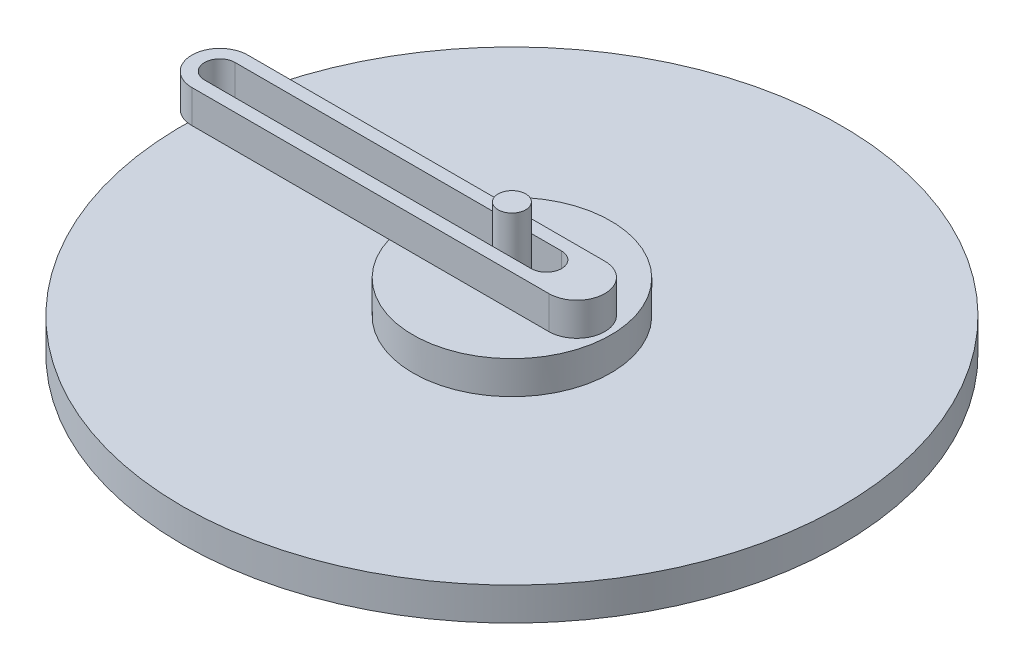
ISO-10303-21;
HEADER;
FILE_DESCRIPTION(('STEP AP214'),'2;1');
FILE_NAME('part.step','',(''),(''),'','','');
FILE_SCHEMA(('AUTOMOTIVE_DESIGN { 1 0 10303 214 1 1 1 1 }'));
ENDSEC;
DATA;
#1=APPLICATION_CONTEXT('core data for automotive mechanical design processes');
#2=APPLICATION_PROTOCOL_DEFINITION('international standard','automotive_design',2000,#1);
#3=PRODUCT_CONTEXT('',#1,'mechanical');
#4=PRODUCT('Part','Part','',(#3));
#5=PRODUCT_RELATED_PRODUCT_CATEGORY('part','',(#4));
#6=PRODUCT_DEFINITION_FORMATION('','',#4);
#7=PRODUCT_DEFINITION_CONTEXT('part definition',#1,'design');
#8=PRODUCT_DEFINITION('design','',#6,#7);
#9=PRODUCT_DEFINITION_SHAPE('','',#8);
#10=(LENGTH_UNIT() NAMED_UNIT(*) SI_UNIT(.MILLI.,.METRE.));
#11=(NAMED_UNIT(*) PLANE_ANGLE_UNIT() SI_UNIT($,.RADIAN.));
#12=(NAMED_UNIT(*) SI_UNIT($,.STERADIAN.) SOLID_ANGLE_UNIT());
#13=UNCERTAINTY_MEASURE_WITH_UNIT(LENGTH_MEASURE(1.E-05),#10,'distance_accuracy_value','');
#14=(GEOMETRIC_REPRESENTATION_CONTEXT(3) GLOBAL_UNCERTAINTY_ASSIGNED_CONTEXT((#13)) GLOBAL_UNIT_ASSIGNED_CONTEXT((#10,
#11,#12)) REPRESENTATION_CONTEXT('',''));
#15=CARTESIAN_POINT('',(0.,0.,0.));
#16=DIRECTION('',(0.,0.,1.));
#17=DIRECTION('',(1.,0.,0.));
#18=AXIS2_PLACEMENT_3D('',#15,#16,#17);
#19=CARTESIAN_POINT('',(0.,5.,0.));
#20=DIRECTION('',(0.,-1.,0.));
#21=DIRECTION('',(0.,0.,-1.));
#22=AXIS2_PLACEMENT_3D('',#19,#20,#21);
#23=CYLINDRICAL_SURFACE('',#22,50.);
#24=CARTESIAN_POINT('',(0.,5.,0.));
#25=DIRECTION('',(0.,1.,0.));
#26=DIRECTION('',(0.,0.,1.));
#27=AXIS2_PLACEMENT_3D('',#24,#25,#26);
#28=CIRCLE('',#27,50.);
#29=CARTESIAN_POINT('',(0.,5.,50.));
#30=VERTEX_POINT('',#29);
#31=EDGE_CURVE('E196',#30,#30,#28,.T.);
#32=ORIENTED_EDGE('',*,*,#31,.F.);
#33=EDGE_LOOP('',(#32));
#34=FACE_BOUND('',#33,.T.);
#35=CARTESIAN_POINT('',(0.,0.,0.));
#36=DIRECTION('',(0.,1.,0.));
#37=DIRECTION('',(0.,0.,1.));
#38=AXIS2_PLACEMENT_3D('',#35,#36,#37);
#39=CIRCLE('',#38,50.);
#40=CARTESIAN_POINT('',(0.,0.,50.));
#41=VERTEX_POINT('',#40);
#42=EDGE_CURVE('E38',#41,#41,#39,.T.);
#43=ORIENTED_EDGE('',*,*,#42,.T.);
#44=EDGE_LOOP('',(#43));
#45=FACE_BOUND('',#44,.T.);
#46=ADVANCED_FACE('F35',(#34,#45),#23,.T.);
#47=CARTESIAN_POINT('',(0.,5.,0.));
#48=DIRECTION('',(0.,1.,0.));
#49=DIRECTION('',(0.,0.,1.));
#50=AXIS2_PLACEMENT_3D('',#47,#48,#49);
#51=PLANE('',#50);
#52=CARTESIAN_POINT('',(0.,5.,0.));
#53=DIRECTION('',(0.,1.,0.));
#54=DIRECTION('',(0.,0.,1.));
#55=AXIS2_PLACEMENT_3D('',#52,#53,#54);
#56=CIRCLE('',#55,15.);
#57=CARTESIAN_POINT('',(0.,5.,15.));
#58=VERTEX_POINT('',#57);
#59=EDGE_CURVE('E43',#58,#58,#56,.T.);
#60=ORIENTED_EDGE('',*,*,#59,.F.);
#61=EDGE_LOOP('',(#60));
#62=FACE_BOUND('',#61,.T.);
#63=ORIENTED_EDGE('',*,*,#31,.T.);
#64=EDGE_LOOP('',(#63));
#65=FACE_BOUND('',#64,.T.);
#66=ADVANCED_FACE('F207',(#62,#65),#51,.T.);
#67=CARTESIAN_POINT('',(0.,0.,0.));
#68=DIRECTION('',(0.,1.,0.));
#69=DIRECTION('',(0.,0.,1.));
#70=AXIS2_PLACEMENT_3D('',#67,#68,#69);
#71=PLANE('',#70);
#72=ORIENTED_EDGE('',*,*,#42,.F.);
#73=EDGE_LOOP('',(#72));
#74=FACE_BOUND('',#73,.T.);
#75=ADVANCED_FACE('F204',(#74),#71,.F.);
#76=CARTESIAN_POINT('',(0.,10.,0.));
#77=DIRECTION('',(0.,-1.,0.));
#78=DIRECTION('',(0.,0.,-1.));
#79=AXIS2_PLACEMENT_3D('',#76,#77,#78);
#80=CYLINDRICAL_SURFACE('',#79,15.);
#81=CARTESIAN_POINT('',(0.,10.,0.));
#82=DIRECTION('',(0.,1.,0.));
#83=DIRECTION('',(0.,0.,1.));
#84=AXIS2_PLACEMENT_3D('',#81,#82,#83);
#85=CIRCLE('',#84,15.);
#86=CARTESIAN_POINT('',(-14.3846167737316,10.,-4.25238759673662));
#87=VERTEX_POINT('',#86);
#88=CARTESIAN_POINT('',(-14.8206413267972,10.,-2.31270202629541));
#89=VERTEX_POINT('',#88);
#90=EDGE_CURVE('E190',#87,#89,#85,.T.);
#91=ORIENTED_EDGE('',*,*,#90,.F.);
#92=CARTESIAN_POINT('',(-14.3846167737316,10.,4.25238759673662));
#93=VERTEX_POINT('',#92);
#94=EDGE_CURVE('E189',#93,#87,#85,.T.);
#95=ORIENTED_EDGE('',*,*,#94,.F.);
#96=CARTESIAN_POINT('',(-14.8206413267972,10.,2.31270202629541));
#97=VERTEX_POINT('',#96);
#98=EDGE_CURVE('E194',#97,#93,#85,.T.);
#99=ORIENTED_EDGE('',*,*,#98,.F.);
#100=EDGE_CURVE('E193',#89,#97,#85,.T.);
#101=ORIENTED_EDGE('',*,*,#100,.F.);
#102=EDGE_LOOP('',(#91,#95,#99,#101));
#103=FACE_BOUND('',#102,.T.);
#104=ORIENTED_EDGE('',*,*,#59,.T.);
#105=EDGE_LOOP('',(#104));
#106=FACE_BOUND('',#105,.T.);
#107=ADVANCED_FACE('F206',(#103,#106),#80,.T.);
#108=CARTESIAN_POINT('',(0.,10.,0.));
#109=DIRECTION('',(0.,1.,0.));
#110=DIRECTION('',(0.,0.,1.));
#111=AXIS2_PLACEMENT_3D('',#108,#109,#110);
#112=PLANE('',#111);
#113=DIRECTION('',(1.,0.,0.));
#114=VECTOR('',#113,1.);
#115=CARTESIAN_POINT('',(9.84763443454786,10.,4.25238759673662));
#116=LINE('',#115,#114);
#117=CARTESIAN_POINT('',(9.84763443454786,10.,4.25238759673662));
#118=VERTEX_POINT('',#117);
#119=EDGE_CURVE('E11',#93,#118,#116,.T.);
#120=ORIENTED_EDGE('',*,*,#119,.F.);
#121=ORIENTED_EDGE('',*,*,#94,.T.);
#122=DIRECTION('',(-1.,0.,0.));
#123=VECTOR('',#122,1.);
#124=CARTESIAN_POINT('',(9.84763443454786,10.,-4.25238759673662));
#125=LINE('',#124,#123);
#126=CARTESIAN_POINT('',(9.84763443454786,10.,-4.25238759673662));
#127=VERTEX_POINT('',#126);
#128=EDGE_CURVE('E172',#127,#87,#125,.T.);
#129=ORIENTED_EDGE('',*,*,#128,.F.);
#130=CARTESIAN_POINT('',(9.84763443454786,10.,0.));
#131=DIRECTION('',(0.,1.,0.));
#132=DIRECTION('',(0.,0.,1.));
#133=AXIS2_PLACEMENT_3D('',#130,#131,#132);
#134=CIRCLE('',#133,4.25238759673662);
#135=EDGE_CURVE('E155',#118,#127,#134,.T.);
#136=ORIENTED_EDGE('',*,*,#135,.F.);
#137=EDGE_LOOP('',(#120,#121,#129,#136));
#138=FACE_BOUND('',#137,.T.);
#139=ADVANCED_FACE('F212',(#138),#112,.T.);
#140=CARTESIAN_POINT('',(9.84763443454786,10.,0.));
#141=DIRECTION('',(0.,1.,0.));
#142=DIRECTION('',(0.,0.,1.));
#143=AXIS2_PLACEMENT_3D('',#140,#141,#142);
#144=PLANE('',#143);
#145=CARTESIAN_POINT('',(-44.3143549554654,10.,0.));
#146=DIRECTION('',(0.,1.,0.));
#147=DIRECTION('',(0.,0.,1.));
#148=AXIS2_PLACEMENT_3D('',#145,#146,#147);
#149=CIRCLE('',#148,2.31270202629541);
#150=CARTESIAN_POINT('',(-44.3143549554654,10.,-2.31270202629541));
#151=VERTEX_POINT('',#150);
#152=CARTESIAN_POINT('',(-44.3143549554654,10.,2.31270202629541));
#153=VERTEX_POINT('',#152);
#154=EDGE_CURVE('E52',#151,#153,#149,.T.);
#155=ORIENTED_EDGE('',*,*,#154,.T.);
#156=DIRECTION('',(1.,0.,0.));
#157=VECTOR('',#156,1.);
#158=CARTESIAN_POINT('',(5.22223038195721,10.,2.31270202629541));
#159=LINE('',#158,#157);
#160=EDGE_CURVE('E121',#153,#97,#159,.T.);
#161=ORIENTED_EDGE('',*,*,#160,.T.);
#162=ORIENTED_EDGE('',*,*,#98,.T.);
#163=CARTESIAN_POINT('',(-44.3143549554654,10.,4.25238759673662));
#164=VERTEX_POINT('',#163);
#165=EDGE_CURVE('E45',#164,#93,#116,.T.);
#166=ORIENTED_EDGE('',*,*,#165,.F.);
#167=CARTESIAN_POINT('',(-44.3143549554654,10.,0.));
#168=DIRECTION('',(0.,1.,0.));
#169=DIRECTION('',(0.,0.,-1.));
#170=AXIS2_PLACEMENT_3D('',#167,#168,#169);
#171=CIRCLE('',#170,4.25238759673662);
#172=CARTESIAN_POINT('',(-44.3143549554654,10.,-4.25238759673662));
#173=VERTEX_POINT('',#172);
#174=EDGE_CURVE('E175',#173,#164,#171,.T.);
#175=ORIENTED_EDGE('',*,*,#174,.F.);
#176=EDGE_CURVE('E171',#87,#173,#125,.T.);
#177=ORIENTED_EDGE('',*,*,#176,.F.);
#178=ORIENTED_EDGE('',*,*,#90,.T.);
#179=DIRECTION('',(-1.,0.,0.));
#180=VECTOR('',#179,1.);
#181=CARTESIAN_POINT('',(5.22223038195721,10.,-2.31270202629541));
#182=LINE('',#181,#180);
#183=EDGE_CURVE('E127',#89,#151,#182,.T.);
#184=ORIENTED_EDGE('',*,*,#183,.T.);
#185=EDGE_LOOP('',(#155,#161,#162,#166,#175,#177,#178,#184));
#186=FACE_BOUND('',#185,.T.);
#187=ADVANCED_FACE('F236',(#186),#144,.F.);
#188=CARTESIAN_POINT('',(9.84763443454786,15.,0.));
#189=DIRECTION('',(0.,-1.,0.));
#190=DIRECTION('',(0.,0.,-1.));
#191=AXIS2_PLACEMENT_3D('',#188,#189,#190);
#192=CYLINDRICAL_SURFACE('',#191,4.25238759673662);
#193=ORIENTED_EDGE('',*,*,#135,.T.);
#194=DIRECTION('',(0.,-1.,0.));
#195=VECTOR('',#194,1.);
#196=CARTESIAN_POINT('',(9.84763443454786,15.,-4.25238759673662));
#197=LINE('',#196,#195);
#198=CARTESIAN_POINT('',(9.84763443454786,15.,-4.25238759673662));
#199=VERTEX_POINT('',#198);
#200=EDGE_CURVE('E186',#199,#127,#197,.T.);
#201=ORIENTED_EDGE('',*,*,#200,.F.);
#202=CARTESIAN_POINT('',(9.84763443454786,15.,0.));
#203=DIRECTION('',(0.,1.,0.));
#204=DIRECTION('',(0.,0.,1.));
#205=AXIS2_PLACEMENT_3D('',#202,#203,#204);
#206=CIRCLE('',#205,4.25238759673662);
#207=CARTESIAN_POINT('',(9.84763443454786,15.,4.25238759673662));
#208=VERTEX_POINT('',#207);
#209=EDGE_CURVE('E159',#208,#199,#206,.T.);
#210=ORIENTED_EDGE('',*,*,#209,.F.);
#211=DIRECTION('',(0.,-1.,0.));
#212=VECTOR('',#211,1.);
#213=CARTESIAN_POINT('',(9.84763443454786,15.,4.25238759673662));
#214=LINE('',#213,#212);
#215=EDGE_CURVE('E168',#208,#118,#214,.T.);
#216=ORIENTED_EDGE('',*,*,#215,.T.);
#217=EDGE_LOOP('',(#193,#201,#210,#216));
#218=FACE_BOUND('',#217,.T.);
#219=ADVANCED_FACE('F245',(#218),#192,.T.);
#220=CARTESIAN_POINT('',(9.84763443454786,15.,-4.25238759673662));
#221=DIRECTION('',(0.,0.,1.));
#222=DIRECTION('',(1.,0.,0.));
#223=AXIS2_PLACEMENT_3D('',#220,#221,#222);
#224=PLANE('',#223);
#225=ORIENTED_EDGE('',*,*,#128,.T.);
#226=ORIENTED_EDGE('',*,*,#176,.T.);
#227=DIRECTION('',(0.,-1.,0.));
#228=VECTOR('',#227,1.);
#229=CARTESIAN_POINT('',(-44.3143549554654,15.,-4.25238759673662));
#230=LINE('',#229,#228);
#231=CARTESIAN_POINT('',(-44.3143549554654,15.,-4.25238759673662));
#232=VERTEX_POINT('',#231);
#233=EDGE_CURVE('E183',#232,#173,#230,.T.);
#234=ORIENTED_EDGE('',*,*,#233,.F.);
#235=DIRECTION('',(-1.,0.,0.));
#236=VECTOR('',#235,1.);
#237=CARTESIAN_POINT('',(9.84763443454786,15.,-4.25238759673662));
#238=LINE('',#237,#236);
#239=EDGE_CURVE('E162',#199,#232,#238,.T.);
#240=ORIENTED_EDGE('',*,*,#239,.F.);
#241=ORIENTED_EDGE('',*,*,#200,.T.);
#242=EDGE_LOOP('',(#225,#226,#234,#240,#241));
#243=FACE_BOUND('',#242,.T.);
#244=ADVANCED_FACE('F250',(#243),#224,.F.);
#245=CARTESIAN_POINT('',(-44.3143549554654,15.,0.));
#246=DIRECTION('',(0.,-1.,0.));
#247=DIRECTION('',(0.,0.,-1.));
#248=AXIS2_PLACEMENT_3D('',#245,#246,#247);
#249=CYLINDRICAL_SURFACE('',#248,4.25238759673662);
#250=ORIENTED_EDGE('',*,*,#174,.T.);
#251=DIRECTION('',(0.,-1.,0.));
#252=VECTOR('',#251,1.);
#253=CARTESIAN_POINT('',(-44.3143549554654,15.,4.25238759673662));
#254=LINE('',#253,#252);
#255=CARTESIAN_POINT('',(-44.3143549554654,15.,4.25238759673662));
#256=VERTEX_POINT('',#255);
#257=EDGE_CURVE('E180',#256,#164,#254,.T.);
#258=ORIENTED_EDGE('',*,*,#257,.F.);
#259=CARTESIAN_POINT('',(-44.3143549554654,15.,0.));
#260=DIRECTION('',(0.,1.,0.));
#261=DIRECTION('',(0.,0.,-1.));
#262=AXIS2_PLACEMENT_3D('',#259,#260,#261);
#263=CIRCLE('',#262,4.25238759673662);
#264=EDGE_CURVE('E164',#232,#256,#263,.T.);
#265=ORIENTED_EDGE('',*,*,#264,.F.);
#266=ORIENTED_EDGE('',*,*,#233,.T.);
#267=EDGE_LOOP('',(#250,#258,#265,#266));
#268=FACE_BOUND('',#267,.T.);
#269=ADVANCED_FACE('F260',(#268),#249,.T.);
#270=CARTESIAN_POINT('',(9.84763443454786,15.,4.25238759673662));
#271=DIRECTION('',(0.,0.,-1.));
#272=DIRECTION('',(-1.,0.,0.));
#273=AXIS2_PLACEMENT_3D('',#270,#271,#272);
#274=PLANE('',#273);
#275=ORIENTED_EDGE('',*,*,#165,.T.);
#276=ORIENTED_EDGE('',*,*,#119,.T.);
#277=ORIENTED_EDGE('',*,*,#215,.F.);
#278=DIRECTION('',(1.,0.,0.));
#279=VECTOR('',#278,1.);
#280=CARTESIAN_POINT('',(9.84763443454786,15.,4.25238759673662));
#281=LINE('',#280,#279);
#282=EDGE_CURVE('E166',#256,#208,#281,.T.);
#283=ORIENTED_EDGE('',*,*,#282,.F.);
#284=ORIENTED_EDGE('',*,*,#257,.T.);
#285=EDGE_LOOP('',(#275,#276,#277,#283,#284));
#286=FACE_BOUND('',#285,.T.);
#287=ADVANCED_FACE('F270',(#286),#274,.F.);
#288=CARTESIAN_POINT('',(9.84763443454786,15.,0.));
#289=DIRECTION('',(0.,1.,0.));
#290=DIRECTION('',(0.,0.,1.));
#291=AXIS2_PLACEMENT_3D('',#288,#289,#290);
#292=PLANE('',#291);
#293=CARTESIAN_POINT('',(5.22223038195721,15.,0.));
#294=DIRECTION('',(0.,1.,0.));
#295=DIRECTION('',(0.,0.,1.));
#296=AXIS2_PLACEMENT_3D('',#293,#294,#295);
#297=CIRCLE('',#296,2.31270202629541);
#298=CARTESIAN_POINT('',(5.22223038195721,15.,2.31270202629541));
#299=VERTEX_POINT('',#298);
#300=CARTESIAN_POINT('',(5.22223038195721,15.,-2.31270202629541));
#301=VERTEX_POINT('',#300);
#302=EDGE_CURVE('E60',#299,#301,#297,.T.);
#303=ORIENTED_EDGE('',*,*,#302,.F.);
#304=DIRECTION('',(1.,0.,0.));
#305=VECTOR('',#304,1.);
#306=CARTESIAN_POINT('',(5.22223038195721,15.,2.31270202629541));
#307=LINE('',#306,#305);
#308=CARTESIAN_POINT('',(-44.3143549554654,15.,2.31270202629541));
#309=VERTEX_POINT('',#308);
#310=EDGE_CURVE('E135',#309,#299,#307,.T.);
#311=ORIENTED_EDGE('',*,*,#310,.F.);
#312=CARTESIAN_POINT('',(-44.3143549554654,15.,0.));
#313=DIRECTION('',(0.,1.,0.));
#314=DIRECTION('',(0.,0.,1.));
#315=AXIS2_PLACEMENT_3D('',#312,#313,#314);
#316=CIRCLE('',#315,2.31270202629541);
#317=CARTESIAN_POINT('',(-44.3143549554654,15.,-2.31270202629541));
#318=VERTEX_POINT('',#317);
#319=EDGE_CURVE('E138',#318,#309,#316,.T.);
#320=ORIENTED_EDGE('',*,*,#319,.F.);
#321=DIRECTION('',(-1.,0.,0.));
#322=VECTOR('',#321,1.);
#323=CARTESIAN_POINT('',(5.22223038195721,15.,-2.31270202629541));
#324=LINE('',#323,#322);
#325=EDGE_CURVE('E148',#301,#318,#324,.T.);
#326=ORIENTED_EDGE('',*,*,#325,.F.);
#327=EDGE_LOOP('',(#303,#311,#320,#326));
#328=FACE_BOUND('',#327,.T.);
#329=ORIENTED_EDGE('',*,*,#209,.T.);
#330=ORIENTED_EDGE('',*,*,#239,.T.);
#331=ORIENTED_EDGE('',*,*,#264,.T.);
#332=ORIENTED_EDGE('',*,*,#282,.T.);
#333=EDGE_LOOP('',(#329,#330,#331,#332));
#334=FACE_BOUND('',#333,.T.);
#335=ADVANCED_FACE('F280',(#328,#334),#292,.T.);
#336=CARTESIAN_POINT('',(5.22223038195721,10.,0.));
#337=DIRECTION('',(0.,1.,0.));
#338=DIRECTION('',(0.,0.,1.));
#339=AXIS2_PLACEMENT_3D('',#336,#337,#338);
#340=PLANE('',#339);
#341=CARTESIAN_POINT('',(0.,10.,0.));
#342=DIRECTION('',(0.,1.,0.));
#343=DIRECTION('',(0.,0.,1.));
#344=AXIS2_PLACEMENT_3D('',#341,#342,#343);
#345=CIRCLE('',#344,2.08889215278291);
#346=CARTESIAN_POINT('',(0.,10.,2.08889215278291));
#347=VERTEX_POINT('',#346);
#348=EDGE_CURVE('E141',#347,#347,#345,.T.);
#349=ORIENTED_EDGE('',*,*,#348,.F.);
#350=EDGE_LOOP('',(#349));
#351=FACE_BOUND('',#350,.T.);
#352=ORIENTED_EDGE('',*,*,#100,.T.);
#353=CARTESIAN_POINT('',(5.22223038195721,10.,2.31270202629541));
#354=VERTEX_POINT('',#353);
#355=EDGE_CURVE('E133',#97,#354,#159,.T.);
#356=ORIENTED_EDGE('',*,*,#355,.T.);
#357=CARTESIAN_POINT('',(5.22223038195721,10.,0.));
#358=DIRECTION('',(0.,1.,0.));
#359=DIRECTION('',(0.,0.,1.));
#360=AXIS2_PLACEMENT_3D('',#357,#358,#359);
#361=CIRCLE('',#360,2.31270202629541);
#362=CARTESIAN_POINT('',(5.22223038195721,10.,-2.31270202629541));
#363=VERTEX_POINT('',#362);
#364=EDGE_CURVE('E116',#354,#363,#361,.T.);
#365=ORIENTED_EDGE('',*,*,#364,.T.);
#366=EDGE_CURVE('E124',#363,#89,#182,.T.);
#367=ORIENTED_EDGE('',*,*,#366,.T.);
#368=EDGE_LOOP('',(#352,#356,#365,#367));
#369=FACE_BOUND('',#368,.T.);
#370=ADVANCED_FACE('F131',(#351,#369),#340,.T.);
#371=CARTESIAN_POINT('',(5.22223038195721,10.,0.));
#372=DIRECTION('',(0.,1.,0.));
#373=DIRECTION('',(0.,0.,1.));
#374=AXIS2_PLACEMENT_3D('',#371,#372,#373);
#375=CYLINDRICAL_SURFACE('',#374,2.31270202629541);
#376=ORIENTED_EDGE('',*,*,#302,.T.);
#377=DIRECTION('',(0.,1.,0.));
#378=VECTOR('',#377,1.);
#379=CARTESIAN_POINT('',(5.22223038195721,10.,-2.31270202629541));
#380=LINE('',#379,#378);
#381=EDGE_CURVE('E112',#363,#301,#380,.T.);
#382=ORIENTED_EDGE('',*,*,#381,.F.);
#383=ORIENTED_EDGE('',*,*,#364,.F.);
#384=DIRECTION('',(0.,1.,0.));
#385=VECTOR('',#384,1.);
#386=CARTESIAN_POINT('',(5.22223038195721,10.,2.31270202629541));
#387=LINE('',#386,#385);
#388=EDGE_CURVE('E153',#354,#299,#387,.T.);
#389=ORIENTED_EDGE('',*,*,#388,.T.);
#390=EDGE_LOOP('',(#376,#382,#383,#389));
#391=FACE_BOUND('',#390,.T.);
#392=ADVANCED_FACE('F114',(#391),#375,.F.);
#393=CARTESIAN_POINT('',(5.22223038195721,10.,2.31270202629541));
#394=DIRECTION('',(0.,0.,1.));
#395=DIRECTION('',(1.,0.,0.));
#396=AXIS2_PLACEMENT_3D('',#393,#394,#395);
#397=PLANE('',#396);
#398=ORIENTED_EDGE('',*,*,#310,.T.);
#399=ORIENTED_EDGE('',*,*,#388,.F.);
#400=ORIENTED_EDGE('',*,*,#355,.F.);
#401=ORIENTED_EDGE('',*,*,#160,.F.);
#402=DIRECTION('',(0.,1.,0.));
#403=VECTOR('',#402,1.);
#404=CARTESIAN_POINT('',(-44.3143549554654,10.,2.31270202629541));
#405=LINE('',#404,#403);
#406=EDGE_CURVE('E156',#153,#309,#405,.T.);
#407=ORIENTED_EDGE('',*,*,#406,.T.);
#408=EDGE_LOOP('',(#398,#399,#400,#401,#407));
#409=FACE_BOUND('',#408,.T.);
#410=ADVANCED_FACE('F313',(#409),#397,.F.);
#411=CARTESIAN_POINT('',(-44.3143549554654,10.,0.));
#412=DIRECTION('',(0.,1.,0.));
#413=DIRECTION('',(0.,0.,1.));
#414=AXIS2_PLACEMENT_3D('',#411,#412,#413);
#415=CYLINDRICAL_SURFACE('',#414,2.31270202629541);
#416=ORIENTED_EDGE('',*,*,#319,.T.);
#417=ORIENTED_EDGE('',*,*,#406,.F.);
#418=ORIENTED_EDGE('',*,*,#154,.F.);
#419=DIRECTION('',(0.,1.,0.));
#420=VECTOR('',#419,1.);
#421=CARTESIAN_POINT('',(-44.3143549554654,10.,-2.31270202629541));
#422=LINE('',#421,#420);
#423=EDGE_CURVE('E120',#151,#318,#422,.T.);
#424=ORIENTED_EDGE('',*,*,#423,.T.);
#425=EDGE_LOOP('',(#416,#417,#418,#424));
#426=FACE_BOUND('',#425,.T.);
#427=ADVANCED_FACE('F322',(#426),#415,.F.);
#428=CARTESIAN_POINT('',(5.22223038195721,10.,-2.31270202629541));
#429=DIRECTION('',(0.,0.,-1.));
#430=DIRECTION('',(-1.,0.,0.));
#431=AXIS2_PLACEMENT_3D('',#428,#429,#430);
#432=PLANE('',#431);
#433=ORIENTED_EDGE('',*,*,#325,.T.);
#434=ORIENTED_EDGE('',*,*,#423,.F.);
#435=ORIENTED_EDGE('',*,*,#183,.F.);
#436=ORIENTED_EDGE('',*,*,#366,.F.);
#437=ORIENTED_EDGE('',*,*,#381,.T.);
#438=EDGE_LOOP('',(#433,#434,#435,#436,#437));
#439=FACE_BOUND('',#438,.T.);
#440=ADVANCED_FACE('F125',(#439),#432,.F.);
#441=CARTESIAN_POINT('',(0.,20.,0.));
#442=DIRECTION('',(0.,-1.,0.));
#443=DIRECTION('',(0.,0.,-1.));
#444=AXIS2_PLACEMENT_3D('',#441,#442,#443);
#445=CYLINDRICAL_SURFACE('',#444,2.08889215278291);
#446=CARTESIAN_POINT('',(0.,20.,0.));
#447=DIRECTION('',(0.,1.,0.));
#448=DIRECTION('',(0.,0.,1.));
#449=AXIS2_PLACEMENT_3D('',#446,#447,#448);
#450=CIRCLE('',#449,2.08889215278291);
#451=CARTESIAN_POINT('',(0.,20.,2.08889215278291));
#452=VERTEX_POINT('',#451);
#453=EDGE_CURVE('E149',#452,#452,#450,.T.);
#454=ORIENTED_EDGE('',*,*,#453,.F.);
#455=EDGE_LOOP('',(#454));
#456=FACE_BOUND('',#455,.T.);
#457=ORIENTED_EDGE('',*,*,#348,.T.);
#458=EDGE_LOOP('',(#457));
#459=FACE_BOUND('',#458,.T.);
#460=ADVANCED_FACE('F340',(#456,#459),#445,.T.);
#461=CARTESIAN_POINT('',(0.,20.,0.));
#462=DIRECTION('',(0.,1.,0.));
#463=DIRECTION('',(0.,0.,1.));
#464=AXIS2_PLACEMENT_3D('',#461,#462,#463);
#465=PLANE('',#464);
#466=ORIENTED_EDGE('',*,*,#453,.T.);
#467=EDGE_LOOP('',(#466));
#468=FACE_BOUND('',#467,.T.);
#469=ADVANCED_FACE('F356',(#468),#465,.T.);
#470=CLOSED_SHELL('',(#46,#66,#75,#107,#139,#187,#219,#244,#269,#287,#335,#370,#392,#410,#427,
#440,#460,#469));
#471=MANIFOLD_SOLID_BREP('B2',#470);
#472=ADVANCED_BREP_SHAPE_REPRESENTATION('',(#18,#471),#14);
#473=SHAPE_DEFINITION_REPRESENTATION(#9,#472);
ENDSEC;
END-ISO-10303-21;
